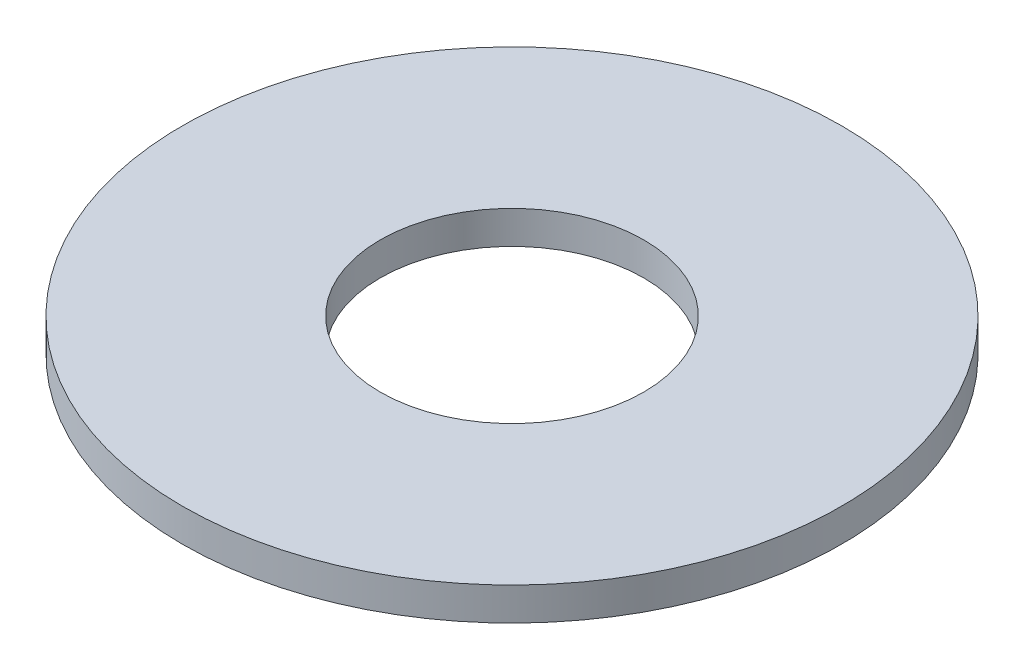
ISO-10303-21;
HEADER;
FILE_DESCRIPTION(('STEP AP214'),'2;1');
FILE_NAME('part.step','',(''),(''),'','','');
FILE_SCHEMA(('AUTOMOTIVE_DESIGN { 1 0 10303 214 1 1 1 1 }'));
ENDSEC;
DATA;
#1=APPLICATION_CONTEXT('core data for automotive mechanical design processes');
#2=APPLICATION_PROTOCOL_DEFINITION('international standard','automotive_design',2000,#1);
#3=PRODUCT_CONTEXT('',#1,'mechanical');
#4=PRODUCT('Part','Part','',(#3));
#5=PRODUCT_RELATED_PRODUCT_CATEGORY('part','',(#4));
#6=PRODUCT_DEFINITION_FORMATION('','',#4);
#7=PRODUCT_DEFINITION_CONTEXT('part definition',#1,'design');
#8=PRODUCT_DEFINITION('design','',#6,#7);
#9=PRODUCT_DEFINITION_SHAPE('','',#8);
#10=(LENGTH_UNIT() NAMED_UNIT(*) SI_UNIT(.MILLI.,.METRE.));
#11=(NAMED_UNIT(*) PLANE_ANGLE_UNIT() SI_UNIT($,.RADIAN.));
#12=(NAMED_UNIT(*) SI_UNIT($,.STERADIAN.) SOLID_ANGLE_UNIT());
#13=UNCERTAINTY_MEASURE_WITH_UNIT(LENGTH_MEASURE(1.E-05),#10,'distance_accuracy_value','');
#14=(GEOMETRIC_REPRESENTATION_CONTEXT(3) GLOBAL_UNCERTAINTY_ASSIGNED_CONTEXT((#13)) GLOBAL_UNIT_ASSIGNED_CONTEXT((#10,
#11,#12)) REPRESENTATION_CONTEXT('',''));
#15=CARTESIAN_POINT('',(0.,0.,0.));
#16=DIRECTION('',(0.,0.,1.));
#17=DIRECTION('',(1.,0.,0.));
#18=AXIS2_PLACEMENT_3D('',#15,#16,#17);
#19=CARTESIAN_POINT('',(0.,0.5,0.));
#20=DIRECTION('',(0.,1.,0.));
#21=DIRECTION('',(0.,0.,1.));
#22=AXIS2_PLACEMENT_3D('',#19,#20,#21);
#23=PLANE('',#22);
#24=CARTESIAN_POINT('',(0.,0.5,0.));
#25=DIRECTION('',(0.,1.,0.));
#26=DIRECTION('',(0.,0.,1.));
#27=AXIS2_PLACEMENT_3D('',#24,#25,#26);
#28=CIRCLE('',#27,5.);
#29=CARTESIAN_POINT('',(0.,0.5,5.));
#30=VERTEX_POINT('',#29);
#31=EDGE_CURVE('E10',#30,#30,#28,.T.);
#32=ORIENTED_EDGE('',*,*,#31,.T.);
#33=EDGE_LOOP('',(#32));
#34=FACE_BOUND('',#33,.T.);
#35=CARTESIAN_POINT('',(0.,0.5,0.));
#36=DIRECTION('',(0.,1.,0.));
#37=DIRECTION('',(0.,0.,1.));
#38=AXIS2_PLACEMENT_3D('',#35,#36,#37);
#39=CIRCLE('',#38,2.);
#40=CARTESIAN_POINT('',(0.,0.5,2.));
#41=VERTEX_POINT('',#40);
#42=EDGE_CURVE('E54',#41,#41,#39,.T.);
#43=ORIENTED_EDGE('',*,*,#42,.F.);
#44=EDGE_LOOP('',(#43));
#45=FACE_BOUND('',#44,.T.);
#46=ADVANCED_FACE('F41',(#34,#45),#23,.T.);
#47=CARTESIAN_POINT('',(0.,0.,0.));
#48=DIRECTION('',(0.,1.,0.));
#49=DIRECTION('',(0.,0.,1.));
#50=AXIS2_PLACEMENT_3D('',#47,#48,#49);
#51=PLANE('',#50);
#52=CARTESIAN_POINT('',(0.,0.,0.));
#53=DIRECTION('',(0.,1.,0.));
#54=DIRECTION('',(0.,0.,1.));
#55=AXIS2_PLACEMENT_3D('',#52,#53,#54);
#56=CIRCLE('',#55,5.);
#57=CARTESIAN_POINT('',(0.,0.,5.));
#58=VERTEX_POINT('',#57);
#59=EDGE_CURVE('E45',#58,#58,#56,.T.);
#60=ORIENTED_EDGE('',*,*,#59,.F.);
#61=EDGE_LOOP('',(#60));
#62=FACE_BOUND('',#61,.T.);
#63=CARTESIAN_POINT('',(0.,0.,0.));
#64=DIRECTION('',(0.,1.,0.));
#65=DIRECTION('',(0.,0.,1.));
#66=AXIS2_PLACEMENT_3D('',#63,#64,#65);
#67=CIRCLE('',#66,2.);
#68=CARTESIAN_POINT('',(0.,0.,2.));
#69=VERTEX_POINT('',#68);
#70=EDGE_CURVE('E56',#69,#69,#67,.T.);
#71=ORIENTED_EDGE('',*,*,#70,.T.);
#72=EDGE_LOOP('',(#71));
#73=FACE_BOUND('',#72,.T.);
#74=ADVANCED_FACE('F68',(#62,#73),#51,.F.);
#75=CARTESIAN_POINT('',(0.,0.5,0.));
#76=DIRECTION('',(0.,-1.,0.));
#77=DIRECTION('',(0.,0.,-1.));
#78=AXIS2_PLACEMENT_3D('',#75,#76,#77);
#79=CYLINDRICAL_SURFACE('',#78,5.);
#80=ORIENTED_EDGE('',*,*,#31,.F.);
#81=EDGE_LOOP('',(#80));
#82=FACE_BOUND('',#81,.T.);
#83=ORIENTED_EDGE('',*,*,#59,.T.);
#84=EDGE_LOOP('',(#83));
#85=FACE_BOUND('',#84,.T.);
#86=ADVANCED_FACE('F43',(#82,#85),#79,.T.);
#87=CARTESIAN_POINT('',(0.,0.5,0.));
#88=DIRECTION('',(0.,-1.,0.));
#89=DIRECTION('',(0.,0.,-1.));
#90=AXIS2_PLACEMENT_3D('',#87,#88,#89);
#91=CYLINDRICAL_SURFACE('',#90,2.);
#92=ORIENTED_EDGE('',*,*,#42,.T.);
#93=EDGE_LOOP('',(#92));
#94=FACE_BOUND('',#93,.T.);
#95=ORIENTED_EDGE('',*,*,#70,.F.);
#96=EDGE_LOOP('',(#95));
#97=FACE_BOUND('',#96,.T.);
#98=ADVANCED_FACE('F64',(#94,#97),#91,.F.);
#99=CLOSED_SHELL('',(#46,#74,#86,#98));
#100=MANIFOLD_SOLID_BREP('B2',#99);
#101=ADVANCED_BREP_SHAPE_REPRESENTATION('',(#18,#100),#14);
#102=SHAPE_DEFINITION_REPRESENTATION(#9,#101);
ENDSEC;
END-ISO-10303-21;
